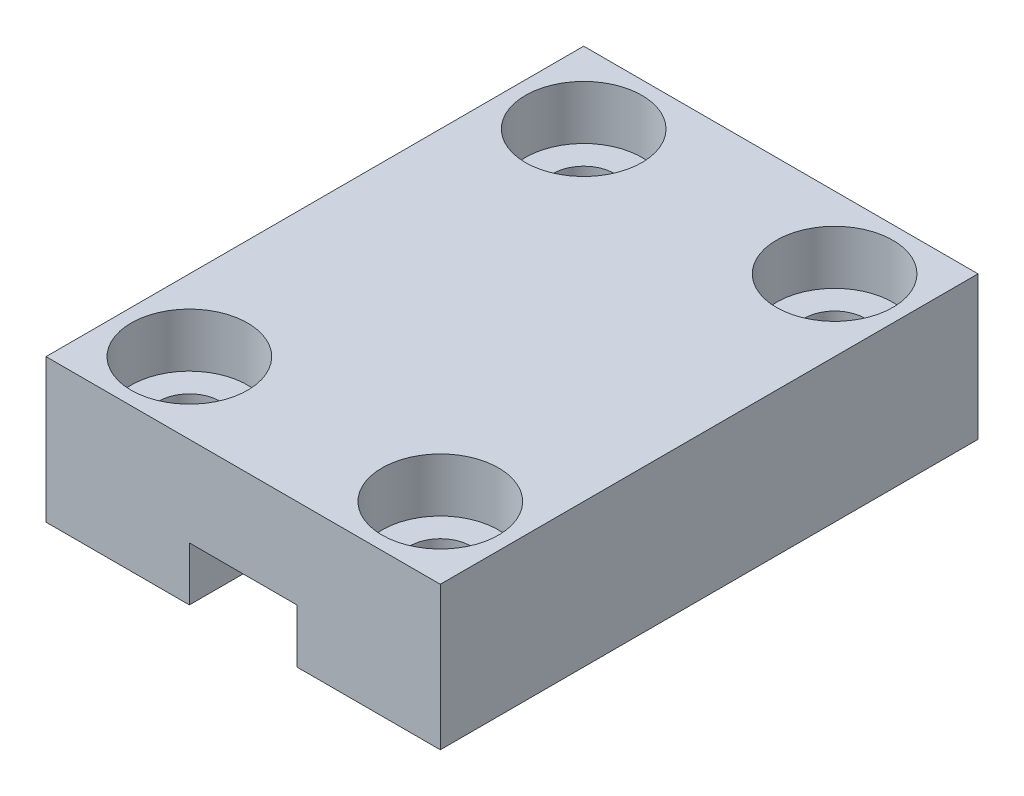
ISO-10303-21;
HEADER;
FILE_DESCRIPTION(('STEP AP214'),'2;1');
FILE_NAME('part.step','',(''),(''),'','','');
FILE_SCHEMA(('AUTOMOTIVE_DESIGN { 1 0 10303 214 1 1 1 1 }'));
ENDSEC;
DATA;
#1=APPLICATION_CONTEXT('core data for automotive mechanical design processes');
#2=APPLICATION_PROTOCOL_DEFINITION('international standard','automotive_design',2000,#1);
#3=PRODUCT_CONTEXT('',#1,'mechanical');
#4=PRODUCT('Part','Part','',(#3));
#5=PRODUCT_RELATED_PRODUCT_CATEGORY('part','',(#4));
#6=PRODUCT_DEFINITION_FORMATION('','',#4);
#7=PRODUCT_DEFINITION_CONTEXT('part definition',#1,'design');
#8=PRODUCT_DEFINITION('design','',#6,#7);
#9=PRODUCT_DEFINITION_SHAPE('','',#8);
#10=(LENGTH_UNIT() NAMED_UNIT(*) SI_UNIT(.MILLI.,.METRE.));
#11=(NAMED_UNIT(*) PLANE_ANGLE_UNIT() SI_UNIT($,.RADIAN.));
#12=(NAMED_UNIT(*) SI_UNIT($,.STERADIAN.) SOLID_ANGLE_UNIT());
#13=UNCERTAINTY_MEASURE_WITH_UNIT(LENGTH_MEASURE(1.E-05),#10,'distance_accuracy_value','');
#14=(GEOMETRIC_REPRESENTATION_CONTEXT(3) GLOBAL_UNCERTAINTY_ASSIGNED_CONTEXT((#13)) GLOBAL_UNIT_ASSIGNED_CONTEXT((#10,
#11,#12)) REPRESENTATION_CONTEXT('',''));
#15=CARTESIAN_POINT('',(0.,0.,0.));
#16=DIRECTION('',(0.,0.,1.));
#17=DIRECTION('',(1.,0.,0.));
#18=AXIS2_PLACEMENT_3D('',#15,#16,#17);
#19=CARTESIAN_POINT('',(-3.,3.,30.));
#20=DIRECTION('',(-1.,0.,0.));
#21=DIRECTION('',(0.,0.,1.));
#22=AXIS2_PLACEMENT_3D('',#19,#20,#21);
#23=PLANE('',#22);
#24=DIRECTION('',(0.,1.,0.));
#25=VECTOR('',#24,1.);
#26=CARTESIAN_POINT('',(-3.,3.,0.));
#27=LINE('',#26,#25);
#28=CARTESIAN_POINT('',(-3.,0.,0.));
#29=VERTEX_POINT('',#28);
#30=CARTESIAN_POINT('',(-3.,3.,0.));
#31=VERTEX_POINT('',#30);
#32=EDGE_CURVE('E131',#29,#31,#27,.T.);
#33=ORIENTED_EDGE('',*,*,#32,.T.);
#34=DIRECTION('',(0.,0.,-1.));
#35=VECTOR('',#34,1.);
#36=CARTESIAN_POINT('',(-3.,3.,30.));
#37=LINE('',#36,#35);
#38=CARTESIAN_POINT('',(-3.,3.,30.));
#39=VERTEX_POINT('',#38);
#40=EDGE_CURVE('E11',#39,#31,#37,.T.);
#41=ORIENTED_EDGE('',*,*,#40,.F.);
#42=DIRECTION('',(0.,1.,0.));
#43=VECTOR('',#42,1.);
#44=CARTESIAN_POINT('',(-3.,3.,30.));
#45=LINE('',#44,#43);
#46=CARTESIAN_POINT('',(-3.,0.,30.));
#47=VERTEX_POINT('',#46);
#48=EDGE_CURVE('E146',#47,#39,#45,.T.);
#49=ORIENTED_EDGE('',*,*,#48,.F.);
#50=DIRECTION('',(0.,0.,-1.));
#51=VECTOR('',#50,1.);
#52=CARTESIAN_POINT('',(-3.,0.,30.));
#53=LINE('',#52,#51);
#54=EDGE_CURVE('E127',#47,#29,#53,.T.);
#55=ORIENTED_EDGE('',*,*,#54,.T.);
#56=EDGE_LOOP('',(#33,#41,#49,#55));
#57=FACE_BOUND('',#56,.T.);
#58=ADVANCED_FACE('F35',(#57),#23,.F.);
#59=CARTESIAN_POINT('',(3.,3.,30.));
#60=DIRECTION('',(0.,1.,0.));
#61=DIRECTION('',(-1.,0.,0.));
#62=AXIS2_PLACEMENT_3D('',#59,#60,#61);
#63=PLANE('',#62);
#64=DIRECTION('',(1.,0.,0.));
#65=VECTOR('',#64,1.);
#66=CARTESIAN_POINT('',(3.,3.,0.));
#67=LINE('',#66,#65);
#68=CARTESIAN_POINT('',(3.,3.,0.));
#69=VERTEX_POINT('',#68);
#70=EDGE_CURVE('E134',#31,#69,#67,.T.);
#71=ORIENTED_EDGE('',*,*,#70,.T.);
#72=DIRECTION('',(0.,0.,-1.));
#73=VECTOR('',#72,1.);
#74=CARTESIAN_POINT('',(3.,3.,30.));
#75=LINE('',#74,#73);
#76=CARTESIAN_POINT('',(3.,3.,30.));
#77=VERTEX_POINT('',#76);
#78=EDGE_CURVE('E43',#77,#69,#75,.T.);
#79=ORIENTED_EDGE('',*,*,#78,.F.);
#80=DIRECTION('',(1.,0.,0.));
#81=VECTOR('',#80,1.);
#82=CARTESIAN_POINT('',(3.,3.,30.));
#83=LINE('',#82,#81);
#84=EDGE_CURVE('E94',#39,#77,#83,.T.);
#85=ORIENTED_EDGE('',*,*,#84,.F.);
#86=ORIENTED_EDGE('',*,*,#40,.T.);
#87=EDGE_LOOP('',(#71,#79,#85,#86));
#88=FACE_BOUND('',#87,.T.);
#89=ADVANCED_FACE('F256',(#88),#63,.F.);
#90=CARTESIAN_POINT('',(3.,0.,30.));
#91=DIRECTION('',(1.,0.,0.));
#92=DIRECTION('',(0.,0.,-1.));
#93=AXIS2_PLACEMENT_3D('',#90,#91,#92);
#94=PLANE('',#93);
#95=DIRECTION('',(0.,-1.,0.));
#96=VECTOR('',#95,1.);
#97=CARTESIAN_POINT('',(3.,0.,0.));
#98=LINE('',#97,#96);
#99=CARTESIAN_POINT('',(3.,0.,0.));
#100=VERTEX_POINT('',#99);
#101=EDGE_CURVE('E137',#69,#100,#98,.T.);
#102=ORIENTED_EDGE('',*,*,#101,.T.);
#103=DIRECTION('',(0.,0.,-1.));
#104=VECTOR('',#103,1.);
#105=CARTESIAN_POINT('',(3.,0.,30.));
#106=LINE('',#105,#104);
#107=CARTESIAN_POINT('',(3.,0.,30.));
#108=VERTEX_POINT('',#107);
#109=EDGE_CURVE('E153',#108,#100,#106,.T.);
#110=ORIENTED_EDGE('',*,*,#109,.F.);
#111=DIRECTION('',(0.,-1.,0.));
#112=VECTOR('',#111,1.);
#113=CARTESIAN_POINT('',(3.,0.,30.));
#114=LINE('',#113,#112);
#115=EDGE_CURVE('E161',#77,#108,#114,.T.);
#116=ORIENTED_EDGE('',*,*,#115,.F.);
#117=ORIENTED_EDGE('',*,*,#78,.T.);
#118=EDGE_LOOP('',(#102,#110,#116,#117));
#119=FACE_BOUND('',#118,.T.);
#120=ADVANCED_FACE('F159',(#119),#94,.F.);
#121=CARTESIAN_POINT('',(11.,0.,30.));
#122=DIRECTION('',(0.,1.,0.));
#123=DIRECTION('',(-1.,0.,0.));
#124=AXIS2_PLACEMENT_3D('',#121,#122,#123);
#125=PLANE('',#124);
#126=CARTESIAN_POINT('',(7.,0.,4.));
#127=DIRECTION('',(0.,1.,0.));
#128=DIRECTION('',(0.,0.,1.));
#129=AXIS2_PLACEMENT_3D('',#126,#127,#128);
#130=CIRCLE('',#129,1.7);
#131=CARTESIAN_POINT('',(7.,0.,5.7));
#132=VERTEX_POINT('',#131);
#133=EDGE_CURVE('E202',#132,#132,#130,.T.);
#134=ORIENTED_EDGE('',*,*,#133,.T.);
#135=EDGE_LOOP('',(#134));
#136=FACE_BOUND('',#135,.T.);
#137=CARTESIAN_POINT('',(7.00000000000001,0.,26.));
#138=DIRECTION('',(0.,1.,0.));
#139=DIRECTION('',(0.,0.,1.));
#140=AXIS2_PLACEMENT_3D('',#137,#138,#139);
#141=CIRCLE('',#140,1.7);
#142=CARTESIAN_POINT('',(7.00000000000001,0.,27.7));
#143=VERTEX_POINT('',#142);
#144=EDGE_CURVE('E190',#143,#143,#141,.T.);
#145=ORIENTED_EDGE('',*,*,#144,.T.);
#146=EDGE_LOOP('',(#145));
#147=FACE_BOUND('',#146,.T.);
#148=DIRECTION('',(1.,0.,0.));
#149=VECTOR('',#148,1.);
#150=CARTESIAN_POINT('',(11.,0.,0.));
#151=LINE('',#150,#149);
#152=CARTESIAN_POINT('',(11.,0.,0.));
#153=VERTEX_POINT('',#152);
#154=EDGE_CURVE('E139',#100,#153,#151,.T.);
#155=ORIENTED_EDGE('',*,*,#154,.T.);
#156=DIRECTION('',(0.,0.,-1.));
#157=VECTOR('',#156,1.);
#158=CARTESIAN_POINT('',(11.,0.,30.));
#159=LINE('',#158,#157);
#160=CARTESIAN_POINT('',(11.,0.,30.));
#161=VERTEX_POINT('',#160);
#162=EDGE_CURVE('E150',#161,#153,#159,.T.);
#163=ORIENTED_EDGE('',*,*,#162,.F.);
#164=DIRECTION('',(1.,0.,0.));
#165=VECTOR('',#164,1.);
#166=CARTESIAN_POINT('',(11.,0.,30.));
#167=LINE('',#166,#165);
#168=EDGE_CURVE('E173',#108,#161,#167,.T.);
#169=ORIENTED_EDGE('',*,*,#168,.F.);
#170=ORIENTED_EDGE('',*,*,#109,.T.);
#171=EDGE_LOOP('',(#155,#163,#169,#170));
#172=FACE_BOUND('',#171,.T.);
#173=ADVANCED_FACE('F169',(#136,#147,#172),#125,.F.);
#174=CARTESIAN_POINT('',(11.,8.,30.));
#175=DIRECTION('',(-1.,0.,0.));
#176=DIRECTION('',(0.,-1.,0.));
#177=AXIS2_PLACEMENT_3D('',#174,#175,#176);
#178=PLANE('',#177);
#179=DIRECTION('',(0.,1.,0.));
#180=VECTOR('',#179,1.);
#181=CARTESIAN_POINT('',(11.,8.,0.));
#182=LINE('',#181,#180);
#183=CARTESIAN_POINT('',(11.,8.,0.));
#184=VERTEX_POINT('',#183);
#185=EDGE_CURVE('E141',#153,#184,#182,.T.);
#186=ORIENTED_EDGE('',*,*,#185,.T.);
#187=DIRECTION('',(0.,0.,-1.));
#188=VECTOR('',#187,1.);
#189=CARTESIAN_POINT('',(11.,8.,30.));
#190=LINE('',#189,#188);
#191=CARTESIAN_POINT('',(11.,8.,30.));
#192=VERTEX_POINT('',#191);
#193=EDGE_CURVE('E122',#192,#184,#190,.T.);
#194=ORIENTED_EDGE('',*,*,#193,.F.);
#195=DIRECTION('',(0.,1.,0.));
#196=VECTOR('',#195,1.);
#197=CARTESIAN_POINT('',(11.,8.,30.));
#198=LINE('',#197,#196);
#199=EDGE_CURVE('E113',#161,#192,#198,.T.);
#200=ORIENTED_EDGE('',*,*,#199,.F.);
#201=ORIENTED_EDGE('',*,*,#162,.T.);
#202=EDGE_LOOP('',(#186,#194,#200,#201));
#203=FACE_BOUND('',#202,.T.);
#204=ADVANCED_FACE('F172',(#203),#178,.F.);
#205=CARTESIAN_POINT('',(-11.,8.,30.));
#206=DIRECTION('',(0.,-1.,0.));
#207=DIRECTION('',(1.,0.,0.));
#208=AXIS2_PLACEMENT_3D('',#205,#206,#207);
#209=PLANE('',#208);
#210=CARTESIAN_POINT('',(-7.,8.,4.));
#211=DIRECTION('',(0.,1.,0.));
#212=DIRECTION('',(0.,0.,1.));
#213=AXIS2_PLACEMENT_3D('',#210,#211,#212);
#214=CIRCLE('',#213,3.25);
#215=CARTESIAN_POINT('',(-7.,8.,7.25));
#216=VERTEX_POINT('',#215);
#217=EDGE_CURVE('E223',#216,#216,#214,.T.);
#218=ORIENTED_EDGE('',*,*,#217,.F.);
#219=EDGE_LOOP('',(#218));
#220=FACE_BOUND('',#219,.T.);
#221=CARTESIAN_POINT('',(7.,8.,4.));
#222=DIRECTION('',(0.,1.,0.));
#223=DIRECTION('',(0.,0.,1.));
#224=AXIS2_PLACEMENT_3D('',#221,#222,#223);
#225=CIRCLE('',#224,3.25);
#226=CARTESIAN_POINT('',(7.,8.,7.25));
#227=VERTEX_POINT('',#226);
#228=EDGE_CURVE('E211',#227,#227,#225,.T.);
#229=ORIENTED_EDGE('',*,*,#228,.F.);
#230=EDGE_LOOP('',(#229));
#231=FACE_BOUND('',#230,.T.);
#232=CARTESIAN_POINT('',(7.00000000000001,8.,26.));
#233=DIRECTION('',(0.,1.,0.));
#234=DIRECTION('',(0.,0.,1.));
#235=AXIS2_PLACEMENT_3D('',#232,#233,#234);
#236=CIRCLE('',#235,3.25);
#237=CARTESIAN_POINT('',(7.00000000000001,8.,29.25));
#238=VERTEX_POINT('',#237);
#239=EDGE_CURVE('E199',#238,#238,#236,.T.);
#240=ORIENTED_EDGE('',*,*,#239,.F.);
#241=EDGE_LOOP('',(#240));
#242=FACE_BOUND('',#241,.T.);
#243=CARTESIAN_POINT('',(-7.,8.,26.));
#244=DIRECTION('',(0.,1.,0.));
#245=DIRECTION('',(0.,0.,1.));
#246=AXIS2_PLACEMENT_3D('',#243,#244,#245);
#247=CIRCLE('',#246,3.25);
#248=CARTESIAN_POINT('',(-7.,8.,29.25));
#249=VERTEX_POINT('',#248);
#250=EDGE_CURVE('E187',#249,#249,#247,.T.);
#251=ORIENTED_EDGE('',*,*,#250,.F.);
#252=EDGE_LOOP('',(#251));
#253=FACE_BOUND('',#252,.T.);
#254=DIRECTION('',(-1.,0.,0.));
#255=VECTOR('',#254,1.);
#256=CARTESIAN_POINT('',(-11.,8.,0.));
#257=LINE('',#256,#255);
#258=CARTESIAN_POINT('',(-11.,8.,0.));
#259=VERTEX_POINT('',#258);
#260=EDGE_CURVE('E121',#184,#259,#257,.T.);
#261=ORIENTED_EDGE('',*,*,#260,.T.);
#262=DIRECTION('',(0.,0.,-1.));
#263=VECTOR('',#262,1.);
#264=CARTESIAN_POINT('',(-11.,8.,30.));
#265=LINE('',#264,#263);
#266=CARTESIAN_POINT('',(-11.,8.,30.));
#267=VERTEX_POINT('',#266);
#268=EDGE_CURVE('E118',#267,#259,#265,.T.);
#269=ORIENTED_EDGE('',*,*,#268,.F.);
#270=DIRECTION('',(-1.,0.,0.));
#271=VECTOR('',#270,1.);
#272=CARTESIAN_POINT('',(-11.,8.,30.));
#273=LINE('',#272,#271);
#274=EDGE_CURVE('E107',#192,#267,#273,.T.);
#275=ORIENTED_EDGE('',*,*,#274,.F.);
#276=ORIENTED_EDGE('',*,*,#193,.T.);
#277=EDGE_LOOP('',(#261,#269,#275,#276));
#278=FACE_BOUND('',#277,.T.);
#279=ADVANCED_FACE('F119',(#220,#231,#242,#253,#278),#209,.F.);
#280=CARTESIAN_POINT('',(-11.,0.,30.));
#281=DIRECTION('',(1.,0.,0.));
#282=DIRECTION('',(0.,1.,0.));
#283=AXIS2_PLACEMENT_3D('',#280,#281,#282);
#284=PLANE('',#283);
#285=DIRECTION('',(0.,-1.,0.));
#286=VECTOR('',#285,1.);
#287=CARTESIAN_POINT('',(-11.,0.,0.));
#288=LINE('',#287,#286);
#289=CARTESIAN_POINT('',(-11.,0.,0.));
#290=VERTEX_POINT('',#289);
#291=EDGE_CURVE('E80',#259,#290,#288,.T.);
#292=ORIENTED_EDGE('',*,*,#291,.T.);
#293=DIRECTION('',(0.,0.,-1.));
#294=VECTOR('',#293,1.);
#295=CARTESIAN_POINT('',(-11.,0.,30.));
#296=LINE('',#295,#294);
#297=CARTESIAN_POINT('',(-11.,0.,30.));
#298=VERTEX_POINT('',#297);
#299=EDGE_CURVE('E123',#298,#290,#296,.T.);
#300=ORIENTED_EDGE('',*,*,#299,.F.);
#301=DIRECTION('',(0.,-1.,0.));
#302=VECTOR('',#301,1.);
#303=CARTESIAN_POINT('',(-11.,0.,30.));
#304=LINE('',#303,#302);
#305=EDGE_CURVE('E111',#267,#298,#304,.T.);
#306=ORIENTED_EDGE('',*,*,#305,.F.);
#307=ORIENTED_EDGE('',*,*,#268,.T.);
#308=EDGE_LOOP('',(#292,#300,#306,#307));
#309=FACE_BOUND('',#308,.T.);
#310=ADVANCED_FACE('F125',(#309),#284,.F.);
#311=CARTESIAN_POINT('',(-3.,0.,30.));
#312=DIRECTION('',(0.,1.,0.));
#313=DIRECTION('',(-1.,0.,0.));
#314=AXIS2_PLACEMENT_3D('',#311,#312,#313);
#315=PLANE('',#314);
#316=CARTESIAN_POINT('',(-7.,0.,4.));
#317=DIRECTION('',(0.,1.,0.));
#318=DIRECTION('',(0.,0.,1.));
#319=AXIS2_PLACEMENT_3D('',#316,#317,#318);
#320=CIRCLE('',#319,1.7);
#321=CARTESIAN_POINT('',(-7.,0.,5.7));
#322=VERTEX_POINT('',#321);
#323=EDGE_CURVE('E214',#322,#322,#320,.T.);
#324=ORIENTED_EDGE('',*,*,#323,.T.);
#325=EDGE_LOOP('',(#324));
#326=FACE_BOUND('',#325,.T.);
#327=CARTESIAN_POINT('',(-7.,0.,26.));
#328=DIRECTION('',(0.,1.,0.));
#329=DIRECTION('',(0.,0.,1.));
#330=AXIS2_PLACEMENT_3D('',#327,#328,#329);
#331=CIRCLE('',#330,1.7);
#332=CARTESIAN_POINT('',(-7.,0.,27.7));
#333=VERTEX_POINT('',#332);
#334=EDGE_CURVE('E135',#333,#333,#331,.T.);
#335=ORIENTED_EDGE('',*,*,#334,.T.);
#336=EDGE_LOOP('',(#335));
#337=FACE_BOUND('',#336,.T.);
#338=DIRECTION('',(1.,0.,0.));
#339=VECTOR('',#338,1.);
#340=CARTESIAN_POINT('',(-3.,0.,0.));
#341=LINE('',#340,#339);
#342=EDGE_CURVE('E86',#290,#29,#341,.T.);
#343=ORIENTED_EDGE('',*,*,#342,.T.);
#344=ORIENTED_EDGE('',*,*,#54,.F.);
#345=DIRECTION('',(1.,0.,0.));
#346=VECTOR('',#345,1.);
#347=CARTESIAN_POINT('',(-3.,0.,30.));
#348=LINE('',#347,#346);
#349=EDGE_CURVE('E51',#298,#47,#348,.T.);
#350=ORIENTED_EDGE('',*,*,#349,.F.);
#351=ORIENTED_EDGE('',*,*,#299,.T.);
#352=EDGE_LOOP('',(#343,#344,#350,#351));
#353=FACE_BOUND('',#352,.T.);
#354=ADVANCED_FACE('F263',(#326,#337,#353),#315,.F.);
#355=CARTESIAN_POINT('',(0.,0.,30.));
#356=DIRECTION('',(0.,0.,-1.));
#357=DIRECTION('',(-1.,0.,0.));
#358=AXIS2_PLACEMENT_3D('',#355,#356,#357);
#359=PLANE('',#358);
#360=ORIENTED_EDGE('',*,*,#48,.T.);
#361=ORIENTED_EDGE('',*,*,#84,.T.);
#362=ORIENTED_EDGE('',*,*,#115,.T.);
#363=ORIENTED_EDGE('',*,*,#168,.T.);
#364=ORIENTED_EDGE('',*,*,#199,.T.);
#365=ORIENTED_EDGE('',*,*,#274,.T.);
#366=ORIENTED_EDGE('',*,*,#305,.T.);
#367=ORIENTED_EDGE('',*,*,#349,.T.);
#368=EDGE_LOOP('',(#360,#361,#362,#363,#364,#365,#366,#367));
#369=FACE_BOUND('',#368,.T.);
#370=ADVANCED_FACE('F109',(#369),#359,.F.);
#371=CARTESIAN_POINT('',(0.,0.,0.));
#372=DIRECTION('',(0.,0.,-1.));
#373=DIRECTION('',(-1.,0.,0.));
#374=AXIS2_PLACEMENT_3D('',#371,#372,#373);
#375=PLANE('',#374);
#376=ORIENTED_EDGE('',*,*,#32,.F.);
#377=ORIENTED_EDGE('',*,*,#342,.F.);
#378=ORIENTED_EDGE('',*,*,#291,.F.);
#379=ORIENTED_EDGE('',*,*,#260,.F.);
#380=ORIENTED_EDGE('',*,*,#185,.F.);
#381=ORIENTED_EDGE('',*,*,#154,.F.);
#382=ORIENTED_EDGE('',*,*,#101,.F.);
#383=ORIENTED_EDGE('',*,*,#70,.F.);
#384=EDGE_LOOP('',(#376,#377,#378,#379,#380,#381,#382,#383));
#385=FACE_BOUND('',#384,.T.);
#386=ADVANCED_FACE('F165',(#385),#375,.T.);
#387=CARTESIAN_POINT('',(-7.,8.,26.));
#388=DIRECTION('',(0.,1.,0.));
#389=DIRECTION('',(0.,0.,1.));
#390=AXIS2_PLACEMENT_3D('',#387,#388,#389);
#391=CYLINDRICAL_SURFACE('',#390,1.7);
#392=ORIENTED_EDGE('',*,*,#334,.F.);
#393=EDGE_LOOP('',(#392));
#394=FACE_BOUND('',#393,.T.);
#395=CARTESIAN_POINT('',(-7.,5.,26.));
#396=DIRECTION('',(0.,1.,0.));
#397=DIRECTION('',(0.,0.,1.));
#398=AXIS2_PLACEMENT_3D('',#395,#396,#397);
#399=CIRCLE('',#398,1.7);
#400=CARTESIAN_POINT('',(-7.,5.,27.7));
#401=VERTEX_POINT('',#400);
#402=EDGE_CURVE('E181',#401,#401,#399,.T.);
#403=ORIENTED_EDGE('',*,*,#402,.T.);
#404=EDGE_LOOP('',(#403));
#405=FACE_BOUND('',#404,.T.);
#406=ADVANCED_FACE('F251',(#394,#405),#391,.F.);
#407=CARTESIAN_POINT('',(-5.3,5.,26.));
#408=DIRECTION('',(0.,-1.,0.));
#409=DIRECTION('',(0.,0.,-1.));
#410=AXIS2_PLACEMENT_3D('',#407,#408,#409);
#411=PLANE('',#410);
#412=ORIENTED_EDGE('',*,*,#402,.F.);
#413=EDGE_LOOP('',(#412));
#414=FACE_BOUND('',#413,.T.);
#415=CARTESIAN_POINT('',(-7.,5.,26.));
#416=DIRECTION('',(0.,1.,0.));
#417=DIRECTION('',(0.,0.,1.));
#418=AXIS2_PLACEMENT_3D('',#415,#416,#417);
#419=CIRCLE('',#418,3.25);
#420=CARTESIAN_POINT('',(-7.,5.,29.25));
#421=VERTEX_POINT('',#420);
#422=EDGE_CURVE('E184',#421,#421,#419,.T.);
#423=ORIENTED_EDGE('',*,*,#422,.T.);
#424=EDGE_LOOP('',(#423));
#425=FACE_BOUND('',#424,.T.);
#426=ADVANCED_FACE('F241',(#414,#425),#411,.F.);
#427=CARTESIAN_POINT('',(-7.,8.,26.));
#428=DIRECTION('',(0.,1.,0.));
#429=DIRECTION('',(0.,0.,1.));
#430=AXIS2_PLACEMENT_3D('',#427,#428,#429);
#431=CYLINDRICAL_SURFACE('',#430,3.25);
#432=ORIENTED_EDGE('',*,*,#422,.F.);
#433=EDGE_LOOP('',(#432));
#434=FACE_BOUND('',#433,.T.);
#435=ORIENTED_EDGE('',*,*,#250,.T.);
#436=EDGE_LOOP('',(#435));
#437=FACE_BOUND('',#436,.T.);
#438=ADVANCED_FACE('F238',(#434,#437),#431,.F.);
#439=CARTESIAN_POINT('',(7.00000000000001,8.,26.));
#440=DIRECTION('',(0.,1.,0.));
#441=DIRECTION('',(0.,0.,1.));
#442=AXIS2_PLACEMENT_3D('',#439,#440,#441);
#443=CYLINDRICAL_SURFACE('',#442,1.7);
#444=ORIENTED_EDGE('',*,*,#144,.F.);
#445=EDGE_LOOP('',(#444));
#446=FACE_BOUND('',#445,.T.);
#447=CARTESIAN_POINT('',(7.00000000000001,5.,26.));
#448=DIRECTION('',(0.,1.,0.));
#449=DIRECTION('',(0.,0.,1.));
#450=AXIS2_PLACEMENT_3D('',#447,#448,#449);
#451=CIRCLE('',#450,1.7);
#452=CARTESIAN_POINT('',(7.00000000000001,5.,27.7));
#453=VERTEX_POINT('',#452);
#454=EDGE_CURVE('E193',#453,#453,#451,.T.);
#455=ORIENTED_EDGE('',*,*,#454,.T.);
#456=EDGE_LOOP('',(#455));
#457=FACE_BOUND('',#456,.T.);
#458=ADVANCED_FACE('F240',(#446,#457),#443,.F.);
#459=CARTESIAN_POINT('',(8.7,5.,26.));
#460=DIRECTION('',(0.,-1.,0.));
#461=DIRECTION('',(0.,0.,-1.));
#462=AXIS2_PLACEMENT_3D('',#459,#460,#461);
#463=PLANE('',#462);
#464=ORIENTED_EDGE('',*,*,#454,.F.);
#465=EDGE_LOOP('',(#464));
#466=FACE_BOUND('',#465,.T.);
#467=CARTESIAN_POINT('',(7.00000000000001,5.,26.));
#468=DIRECTION('',(0.,1.,0.));
#469=DIRECTION('',(0.,0.,1.));
#470=AXIS2_PLACEMENT_3D('',#467,#468,#469);
#471=CIRCLE('',#470,3.25);
#472=CARTESIAN_POINT('',(7.00000000000001,5.,29.25));
#473=VERTEX_POINT('',#472);
#474=EDGE_CURVE('E196',#473,#473,#471,.T.);
#475=ORIENTED_EDGE('',*,*,#474,.T.);
#476=EDGE_LOOP('',(#475));
#477=FACE_BOUND('',#476,.T.);
#478=ADVANCED_FACE('F248',(#466,#477),#463,.F.);
#479=CARTESIAN_POINT('',(7.00000000000001,8.,26.));
#480=DIRECTION('',(0.,1.,0.));
#481=DIRECTION('',(0.,0.,1.));
#482=AXIS2_PLACEMENT_3D('',#479,#480,#481);
#483=CYLINDRICAL_SURFACE('',#482,3.25);
#484=ORIENTED_EDGE('',*,*,#474,.F.);
#485=EDGE_LOOP('',(#484));
#486=FACE_BOUND('',#485,.T.);
#487=ORIENTED_EDGE('',*,*,#239,.T.);
#488=EDGE_LOOP('',(#487));
#489=FACE_BOUND('',#488,.T.);
#490=ADVANCED_FACE('F348',(#486,#489),#483,.F.);
#491=CARTESIAN_POINT('',(7.,8.,4.));
#492=DIRECTION('',(0.,1.,0.));
#493=DIRECTION('',(0.,0.,1.));
#494=AXIS2_PLACEMENT_3D('',#491,#492,#493);
#495=CYLINDRICAL_SURFACE('',#494,1.7);
#496=ORIENTED_EDGE('',*,*,#133,.F.);
#497=EDGE_LOOP('',(#496));
#498=FACE_BOUND('',#497,.T.);
#499=CARTESIAN_POINT('',(7.,5.,4.));
#500=DIRECTION('',(0.,1.,0.));
#501=DIRECTION('',(0.,0.,1.));
#502=AXIS2_PLACEMENT_3D('',#499,#500,#501);
#503=CIRCLE('',#502,1.7);
#504=CARTESIAN_POINT('',(7.,5.,5.7));
#505=VERTEX_POINT('',#504);
#506=EDGE_CURVE('E205',#505,#505,#503,.T.);
#507=ORIENTED_EDGE('',*,*,#506,.T.);
#508=EDGE_LOOP('',(#507));
#509=FACE_BOUND('',#508,.T.);
#510=ADVANCED_FACE('F358',(#498,#509),#495,.F.);
#511=CARTESIAN_POINT('',(8.7,5.,4.));
#512=DIRECTION('',(0.,-1.,0.));
#513=DIRECTION('',(0.,0.,-1.));
#514=AXIS2_PLACEMENT_3D('',#511,#512,#513);
#515=PLANE('',#514);
#516=ORIENTED_EDGE('',*,*,#506,.F.);
#517=EDGE_LOOP('',(#516));
#518=FACE_BOUND('',#517,.T.);
#519=CARTESIAN_POINT('',(7.,5.,4.));
#520=DIRECTION('',(0.,1.,0.));
#521=DIRECTION('',(0.,0.,1.));
#522=AXIS2_PLACEMENT_3D('',#519,#520,#521);
#523=CIRCLE('',#522,3.25);
#524=CARTESIAN_POINT('',(7.,5.,7.25));
#525=VERTEX_POINT('',#524);
#526=EDGE_CURVE('E208',#525,#525,#523,.T.);
#527=ORIENTED_EDGE('',*,*,#526,.T.);
#528=EDGE_LOOP('',(#527));
#529=FACE_BOUND('',#528,.T.);
#530=ADVANCED_FACE('F368',(#518,#529),#515,.F.);
#531=CARTESIAN_POINT('',(7.,8.,4.));
#532=DIRECTION('',(0.,1.,0.));
#533=DIRECTION('',(0.,0.,1.));
#534=AXIS2_PLACEMENT_3D('',#531,#532,#533);
#535=CYLINDRICAL_SURFACE('',#534,3.25);
#536=ORIENTED_EDGE('',*,*,#526,.F.);
#537=EDGE_LOOP('',(#536));
#538=FACE_BOUND('',#537,.T.);
#539=ORIENTED_EDGE('',*,*,#228,.T.);
#540=EDGE_LOOP('',(#539));
#541=FACE_BOUND('',#540,.T.);
#542=ADVANCED_FACE('F378',(#538,#541),#535,.F.);
#543=CARTESIAN_POINT('',(-7.,8.,4.));
#544=DIRECTION('',(0.,1.,0.));
#545=DIRECTION('',(0.,0.,1.));
#546=AXIS2_PLACEMENT_3D('',#543,#544,#545);
#547=CYLINDRICAL_SURFACE('',#546,1.7);
#548=ORIENTED_EDGE('',*,*,#323,.F.);
#549=EDGE_LOOP('',(#548));
#550=FACE_BOUND('',#549,.T.);
#551=CARTESIAN_POINT('',(-7.,5.,4.));
#552=DIRECTION('',(0.,1.,0.));
#553=DIRECTION('',(0.,0.,1.));
#554=AXIS2_PLACEMENT_3D('',#551,#552,#553);
#555=CIRCLE('',#554,1.7);
#556=CARTESIAN_POINT('',(-7.,5.,5.7));
#557=VERTEX_POINT('',#556);
#558=EDGE_CURVE('E217',#557,#557,#555,.T.);
#559=ORIENTED_EDGE('',*,*,#558,.T.);
#560=EDGE_LOOP('',(#559));
#561=FACE_BOUND('',#560,.T.);
#562=ADVANCED_FACE('F388',(#550,#561),#547,.F.);
#563=CARTESIAN_POINT('',(-5.3,5.,4.));
#564=DIRECTION('',(0.,-1.,0.));
#565=DIRECTION('',(0.,0.,-1.));
#566=AXIS2_PLACEMENT_3D('',#563,#564,#565);
#567=PLANE('',#566);
#568=ORIENTED_EDGE('',*,*,#558,.F.);
#569=EDGE_LOOP('',(#568));
#570=FACE_BOUND('',#569,.T.);
#571=CARTESIAN_POINT('',(-7.,5.,4.));
#572=DIRECTION('',(0.,1.,0.));
#573=DIRECTION('',(0.,0.,1.));
#574=AXIS2_PLACEMENT_3D('',#571,#572,#573);
#575=CIRCLE('',#574,3.25);
#576=CARTESIAN_POINT('',(-7.,5.,7.25));
#577=VERTEX_POINT('',#576);
#578=EDGE_CURVE('E220',#577,#577,#575,.T.);
#579=ORIENTED_EDGE('',*,*,#578,.T.);
#580=EDGE_LOOP('',(#579));
#581=FACE_BOUND('',#580,.T.);
#582=ADVANCED_FACE('F398',(#570,#581),#567,.F.);
#583=CARTESIAN_POINT('',(-7.,8.,4.));
#584=DIRECTION('',(0.,1.,0.));
#585=DIRECTION('',(0.,0.,1.));
#586=AXIS2_PLACEMENT_3D('',#583,#584,#585);
#587=CYLINDRICAL_SURFACE('',#586,3.25);
#588=ORIENTED_EDGE('',*,*,#578,.F.);
#589=EDGE_LOOP('',(#588));
#590=FACE_BOUND('',#589,.T.);
#591=ORIENTED_EDGE('',*,*,#217,.T.);
#592=EDGE_LOOP('',(#591));
#593=FACE_BOUND('',#592,.T.);
#594=ADVANCED_FACE('F227',(#590,#593),#587,.F.);
#595=CLOSED_SHELL('',(#58,#89,#120,#173,#204,#279,#310,#354,#370,#386,#406,#426,#438,#458,#478,
#490,#510,#530,#542,#562,#582,#594));
#596=MANIFOLD_SOLID_BREP('B2',#595);
#597=ADVANCED_BREP_SHAPE_REPRESENTATION('',(#18,#596),#14);
#598=SHAPE_DEFINITION_REPRESENTATION(#9,#597);
ENDSEC;
END-ISO-10303-21;
